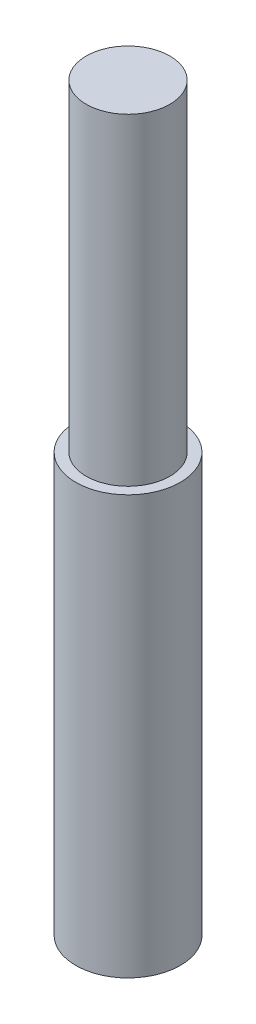
ISO-10303-21;
HEADER;
FILE_DESCRIPTION(('STEP AP214'),'2;1');
FILE_NAME('part.step','',(''),(''),'','','');
FILE_SCHEMA(('AUTOMOTIVE_DESIGN { 1 0 10303 214 1 1 1 1 }'));
ENDSEC;
DATA;
#1=APPLICATION_CONTEXT('core data for automotive mechanical design processes');
#2=APPLICATION_PROTOCOL_DEFINITION('international standard','automotive_design',2000,#1);
#3=PRODUCT_CONTEXT('',#1,'mechanical');
#4=PRODUCT('Part','Part','',(#3));
#5=PRODUCT_RELATED_PRODUCT_CATEGORY('part','',(#4));
#6=PRODUCT_DEFINITION_FORMATION('','',#4);
#7=PRODUCT_DEFINITION_CONTEXT('part definition',#1,'design');
#8=PRODUCT_DEFINITION('design','',#6,#7);
#9=PRODUCT_DEFINITION_SHAPE('','',#8);
#10=(LENGTH_UNIT() NAMED_UNIT(*) SI_UNIT(.MILLI.,.METRE.));
#11=(NAMED_UNIT(*) PLANE_ANGLE_UNIT() SI_UNIT($,.RADIAN.));
#12=(NAMED_UNIT(*) SI_UNIT($,.STERADIAN.) SOLID_ANGLE_UNIT());
#13=UNCERTAINTY_MEASURE_WITH_UNIT(LENGTH_MEASURE(1.E-05),#10,'distance_accuracy_value','');
#14=(GEOMETRIC_REPRESENTATION_CONTEXT(3) GLOBAL_UNCERTAINTY_ASSIGNED_CONTEXT((#13)) GLOBAL_UNIT_ASSIGNED_CONTEXT((#10,
#11,#12)) REPRESENTATION_CONTEXT('',''));
#15=CARTESIAN_POINT('',(0.,0.,0.));
#16=DIRECTION('',(0.,0.,1.));
#17=DIRECTION('',(1.,0.,0.));
#18=AXIS2_PLACEMENT_3D('',#15,#16,#17);
#19=CARTESIAN_POINT('',(0.,0.399999999999999,0.));
#20=DIRECTION('',(0.,-1.,0.));
#21=DIRECTION('',(0.,0.,-1.));
#22=AXIS2_PLACEMENT_3D('',#19,#20,#21);
#23=TOROIDAL_SURFACE('',#22,2.4,0.4);
#24=CARTESIAN_POINT('',(0.,0.,0.));
#25=DIRECTION('',(0.,-1.,0.));
#26=DIRECTION('',(0.,0.,-1.));
#27=AXIS2_PLACEMENT_3D('',#24,#25,#26);
#28=CIRCLE('',#27,2.4);
#29=CARTESIAN_POINT('',(0.,0.,-2.4));
#30=VERTEX_POINT('',#29);
#31=EDGE_CURVE('E37',#30,#30,#28,.F.);
#32=ORIENTED_EDGE('',*,*,#31,.F.);
#33=EDGE_LOOP('',(#32));
#34=FACE_BOUND('',#33,.T.);
#35=CARTESIAN_POINT('',(0.,0.399999999999999,0.));
#36=DIRECTION('',(0.,-1.,0.));
#37=DIRECTION('',(0.,0.,-1.));
#38=AXIS2_PLACEMENT_3D('',#35,#36,#37);
#39=CIRCLE('',#38,2.);
#40=CARTESIAN_POINT('',(0.,0.399999999999999,-2.));
#41=VERTEX_POINT('',#40);
#42=EDGE_CURVE('E10',#41,#41,#39,.T.);
#43=ORIENTED_EDGE('',*,*,#42,.F.);
#44=EDGE_LOOP('',(#43));
#45=FACE_BOUND('',#44,.T.);
#46=ADVANCED_FACE('F31',(#34,#45),#23,.T.);
#47=CARTESIAN_POINT('',(2.5,0.,0.));
#48=DIRECTION('',(0.,-1.,0.));
#49=DIRECTION('',(0.,0.,-1.));
#50=AXIS2_PLACEMENT_3D('',#47,#48,#49);
#51=PLANE('',#50);
#52=ORIENTED_EDGE('',*,*,#31,.T.);
#53=EDGE_LOOP('',(#52));
#54=FACE_BOUND('',#53,.T.);
#55=CARTESIAN_POINT('',(0.,0.,0.));
#56=DIRECTION('',(0.,-1.,0.));
#57=DIRECTION('',(0.,0.,-1.));
#58=AXIS2_PLACEMENT_3D('',#55,#56,#57);
#59=CIRCLE('',#58,2.5);
#60=CARTESIAN_POINT('',(0.,0.,-2.5));
#61=VERTEX_POINT('',#60);
#62=EDGE_CURVE('E53',#61,#61,#59,.T.);
#63=ORIENTED_EDGE('',*,*,#62,.T.);
#64=EDGE_LOOP('',(#63));
#65=FACE_BOUND('',#64,.T.);
#66=ADVANCED_FACE('F75',(#54,#65),#51,.T.);
#67=CARTESIAN_POINT('',(0.,35.4,0.));
#68=DIRECTION('',(0.,1.,0.));
#69=DIRECTION('',(0.,0.,1.));
#70=AXIS2_PLACEMENT_3D('',#67,#68,#69);
#71=PLANE('',#70);
#72=CARTESIAN_POINT('',(0.,35.4,0.));
#73=DIRECTION('',(0.,-1.,0.));
#74=DIRECTION('',(0.,0.,-1.));
#75=AXIS2_PLACEMENT_3D('',#72,#73,#74);
#76=CIRCLE('',#75,2.);
#77=CARTESIAN_POINT('',(0.,35.4,-2.));
#78=VERTEX_POINT('',#77);
#79=EDGE_CURVE('E41',#78,#78,#76,.T.);
#80=ORIENTED_EDGE('',*,*,#79,.F.);
#81=EDGE_LOOP('',(#80));
#82=FACE_BOUND('',#81,.T.);
#83=ADVANCED_FACE('F80',(#82),#71,.T.);
#84=CARTESIAN_POINT('',(0.,0.,0.));
#85=DIRECTION('',(0.,-1.,0.));
#86=DIRECTION('',(0.,0.,-1.));
#87=AXIS2_PLACEMENT_3D('',#84,#85,#86);
#88=CYLINDRICAL_SURFACE('',#87,2.);
#89=ORIENTED_EDGE('',*,*,#79,.T.);
#90=EDGE_LOOP('',(#89));
#91=FACE_BOUND('',#90,.T.);
#92=CARTESIAN_POINT('',(0.,20.,0.));
#93=DIRECTION('',(0.,-1.,0.));
#94=DIRECTION('',(0.,0.,-1.));
#95=AXIS2_PLACEMENT_3D('',#92,#93,#94);
#96=CIRCLE('',#95,2.);
#97=CARTESIAN_POINT('',(0.,20.,-2.));
#98=VERTEX_POINT('',#97);
#99=EDGE_CURVE('E45',#98,#98,#96,.T.);
#100=ORIENTED_EDGE('',*,*,#99,.F.);
#101=EDGE_LOOP('',(#100));
#102=FACE_BOUND('',#101,.T.);
#103=ADVANCED_FACE('F85',(#91,#102),#88,.T.);
#104=CARTESIAN_POINT('',(2.,20.,0.));
#105=DIRECTION('',(0.,1.,0.));
#106=DIRECTION('',(0.,0.,1.));
#107=AXIS2_PLACEMENT_3D('',#104,#105,#106);
#108=PLANE('',#107);
#109=ORIENTED_EDGE('',*,*,#99,.T.);
#110=EDGE_LOOP('',(#109));
#111=FACE_BOUND('',#110,.T.);
#112=CARTESIAN_POINT('',(0.,20.,0.));
#113=DIRECTION('',(0.,-1.,0.));
#114=DIRECTION('',(0.,0.,-1.));
#115=AXIS2_PLACEMENT_3D('',#112,#113,#114);
#116=CIRCLE('',#115,2.5);
#117=CARTESIAN_POINT('',(0.,20.,-2.5));
#118=VERTEX_POINT('',#117);
#119=EDGE_CURVE('E50',#118,#118,#116,.T.);
#120=ORIENTED_EDGE('',*,*,#119,.F.);
#121=EDGE_LOOP('',(#120));
#122=FACE_BOUND('',#121,.T.);
#123=ADVANCED_FACE('F71',(#111,#122),#108,.T.);
#124=CARTESIAN_POINT('',(0.,0.,0.));
#125=DIRECTION('',(0.,-1.,0.));
#126=DIRECTION('',(0.,0.,-1.));
#127=AXIS2_PLACEMENT_3D('',#124,#125,#126);
#128=CYLINDRICAL_SURFACE('',#127,2.5);
#129=ORIENTED_EDGE('',*,*,#119,.T.);
#130=EDGE_LOOP('',(#129));
#131=FACE_BOUND('',#130,.T.);
#132=ORIENTED_EDGE('',*,*,#62,.F.);
#133=EDGE_LOOP('',(#132));
#134=FACE_BOUND('',#133,.T.);
#135=ADVANCED_FACE('F64',(#131,#134),#128,.T.);
#136=CARTESIAN_POINT('',(0.,10.,0.));
#137=DIRECTION('',(0.,-1.,0.));
#138=DIRECTION('',(0.,0.,-1.));
#139=AXIS2_PLACEMENT_3D('',#136,#137,#138);
#140=CYLINDRICAL_SURFACE('',#139,2.);
#141=ORIENTED_EDGE('',*,*,#42,.T.);
#142=EDGE_LOOP('',(#141));
#143=FACE_BOUND('',#142,.T.);
#144=CARTESIAN_POINT('',(0.,10.,0.));
#145=DIRECTION('',(0.,-1.,0.));
#146=DIRECTION('',(0.,0.,-1.));
#147=AXIS2_PLACEMENT_3D('',#144,#145,#146);
#148=CIRCLE('',#147,2.);
#149=CARTESIAN_POINT('',(0.,10.,-2.));
#150=VERTEX_POINT('',#149);
#151=EDGE_CURVE('E56',#150,#150,#148,.T.);
#152=ORIENTED_EDGE('',*,*,#151,.F.);
#153=EDGE_LOOP('',(#152));
#154=FACE_BOUND('',#153,.T.);
#155=ADVANCED_FACE('F62',(#143,#154),#140,.F.);
#156=CARTESIAN_POINT('',(0.,10.,0.));
#157=DIRECTION('',(0.,-1.,0.));
#158=DIRECTION('',(0.,0.,-1.));
#159=AXIS2_PLACEMENT_3D('',#156,#157,#158);
#160=PLANE('',#159);
#161=ORIENTED_EDGE('',*,*,#151,.T.);
#162=EDGE_LOOP('',(#161));
#163=FACE_BOUND('',#162,.T.);
#164=ADVANCED_FACE('F60',(#163),#160,.T.);
#165=CLOSED_SHELL('',(#46,#66,#83,#103,#123,#135,#155,#164));
#166=MANIFOLD_SOLID_BREP('B2',#165);
#167=ADVANCED_BREP_SHAPE_REPRESENTATION('',(#18,#166),#14);
#168=SHAPE_DEFINITION_REPRESENTATION(#9,#167);
ENDSEC;
END-ISO-10303-21;
